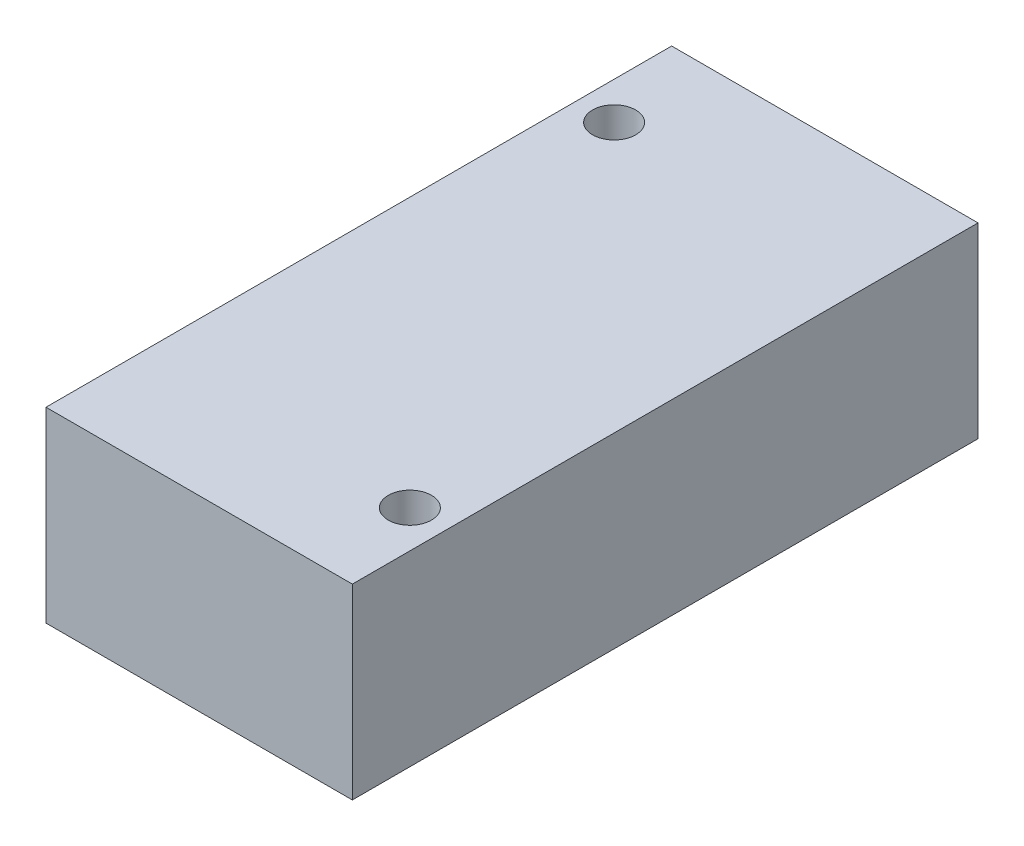
ISO-10303-21;
HEADER;
FILE_DESCRIPTION(('STEP AP214'),'2;1');
FILE_NAME('part.step','',(''),(''),'','','');
FILE_SCHEMA(('AUTOMOTIVE_DESIGN { 1 0 10303 214 1 1 1 1 }'));
ENDSEC;
DATA;
#1=APPLICATION_CONTEXT('core data for automotive mechanical design processes');
#2=APPLICATION_PROTOCOL_DEFINITION('international standard','automotive_design',2000,#1);
#3=PRODUCT_CONTEXT('',#1,'mechanical');
#4=PRODUCT('Part','Part','',(#3));
#5=PRODUCT_RELATED_PRODUCT_CATEGORY('part','',(#4));
#6=PRODUCT_DEFINITION_FORMATION('','',#4);
#7=PRODUCT_DEFINITION_CONTEXT('part definition',#1,'design');
#8=PRODUCT_DEFINITION('design','',#6,#7);
#9=PRODUCT_DEFINITION_SHAPE('','',#8);
#10=(LENGTH_UNIT() NAMED_UNIT(*) SI_UNIT(.MILLI.,.METRE.));
#11=(NAMED_UNIT(*) PLANE_ANGLE_UNIT() SI_UNIT($,.RADIAN.));
#12=(NAMED_UNIT(*) SI_UNIT($,.STERADIAN.) SOLID_ANGLE_UNIT());
#13=UNCERTAINTY_MEASURE_WITH_UNIT(LENGTH_MEASURE(1.E-05),#10,'distance_accuracy_value','');
#14=(GEOMETRIC_REPRESENTATION_CONTEXT(3) GLOBAL_UNCERTAINTY_ASSIGNED_CONTEXT((#13)) GLOBAL_UNIT_ASSIGNED_CONTEXT((#10,
#11,#12)) REPRESENTATION_CONTEXT('',''));
#15=CARTESIAN_POINT('',(0.,0.,0.));
#16=DIRECTION('',(0.,0.,1.));
#17=DIRECTION('',(1.,0.,0.));
#18=AXIS2_PLACEMENT_3D('',#15,#16,#17);
#19=CARTESIAN_POINT('',(0.,13.,0.));
#20=DIRECTION('',(0.,-1.,0.));
#21=DIRECTION('',(0.,0.,-1.));
#22=AXIS2_PLACEMENT_3D('',#19,#20,#21);
#23=PLANE('',#22);
#24=DIRECTION('',(0.,0.,-1.));
#25=VECTOR('',#24,1.);
#26=CARTESIAN_POINT('',(10.65,13.,21.75));
#27=LINE('',#26,#25);
#28=CARTESIAN_POINT('',(10.65,13.,21.75));
#29=VERTEX_POINT('',#28);
#30=CARTESIAN_POINT('',(10.65,13.,-21.75));
#31=VERTEX_POINT('',#30);
#32=EDGE_CURVE('E86',#29,#31,#27,.T.);
#33=ORIENTED_EDGE('',*,*,#32,.T.);
#34=DIRECTION('',(-1.,0.,0.));
#35=VECTOR('',#34,1.);
#36=CARTESIAN_POINT('',(-10.65,13.,-21.75));
#37=LINE('',#36,#35);
#38=CARTESIAN_POINT('',(-10.65,13.,-21.75));
#39=VERTEX_POINT('',#38);
#40=EDGE_CURVE('E81',#31,#39,#37,.T.);
#41=ORIENTED_EDGE('',*,*,#40,.T.);
#42=DIRECTION('',(0.,0.,1.));
#43=VECTOR('',#42,1.);
#44=CARTESIAN_POINT('',(-10.65,13.,21.75));
#45=LINE('',#44,#43);
#46=CARTESIAN_POINT('',(-10.65,13.,21.75));
#47=VERTEX_POINT('',#46);
#48=EDGE_CURVE('E84',#39,#47,#45,.T.);
#49=ORIENTED_EDGE('',*,*,#48,.T.);
#50=DIRECTION('',(1.,0.,0.));
#51=VECTOR('',#50,1.);
#52=CARTESIAN_POINT('',(-10.65,13.,21.75));
#53=LINE('',#52,#51);
#54=EDGE_CURVE('E51',#47,#29,#53,.T.);
#55=ORIENTED_EDGE('',*,*,#54,.T.);
#56=EDGE_LOOP('',(#33,#41,#49,#55));
#57=FACE_BOUND('',#56,.T.);
#58=CARTESIAN_POINT('',(-8.05,13.,-15.15));
#59=DIRECTION('',(0.,1.,0.));
#60=DIRECTION('',(0.,0.,1.));
#61=AXIS2_PLACEMENT_3D('',#58,#59,#60);
#62=CIRCLE('',#61,1.5);
#63=CARTESIAN_POINT('',(-8.05,13.,-16.65));
#64=VERTEX_POINT('',#63);
#65=EDGE_CURVE('E101',#64,#64,#62,.T.);
#66=ORIENTED_EDGE('',*,*,#65,.F.);
#67=EDGE_LOOP('',(#66));
#68=FACE_BOUND('',#67,.T.);
#69=CARTESIAN_POINT('',(8.05,13.,15.15));
#70=DIRECTION('',(0.,1.,0.));
#71=DIRECTION('',(0.,0.,1.));
#72=AXIS2_PLACEMENT_3D('',#69,#70,#71);
#73=CIRCLE('',#72,1.5);
#74=CARTESIAN_POINT('',(8.05,13.,13.65));
#75=VERTEX_POINT('',#74);
#76=EDGE_CURVE('E116',#75,#75,#73,.T.);
#77=ORIENTED_EDGE('',*,*,#76,.F.);
#78=EDGE_LOOP('',(#77));
#79=FACE_BOUND('',#78,.T.);
#80=ADVANCED_FACE('F34',(#57,#68,#79),#23,.F.);
#81=CARTESIAN_POINT('',(0.,0.,0.));
#82=DIRECTION('',(0.,-1.,0.));
#83=DIRECTION('',(0.,0.,-1.));
#84=AXIS2_PLACEMENT_3D('',#81,#82,#83);
#85=PLANE('',#84);
#86=CARTESIAN_POINT('',(-8.05,0.,-15.15));
#87=DIRECTION('',(0.,1.,0.));
#88=DIRECTION('',(0.,0.,1.));
#89=AXIS2_PLACEMENT_3D('',#86,#87,#88);
#90=CIRCLE('',#89,1.5);
#91=CARTESIAN_POINT('',(-8.05,0.,-16.65));
#92=VERTEX_POINT('',#91);
#93=EDGE_CURVE('E113',#92,#92,#90,.T.);
#94=ORIENTED_EDGE('',*,*,#93,.T.);
#95=EDGE_LOOP('',(#94));
#96=FACE_BOUND('',#95,.T.);
#97=DIRECTION('',(0.,0.,-1.));
#98=VECTOR('',#97,1.);
#99=CARTESIAN_POINT('',(10.65,0.,21.75));
#100=LINE('',#99,#98);
#101=CARTESIAN_POINT('',(10.65,0.,21.75));
#102=VERTEX_POINT('',#101);
#103=CARTESIAN_POINT('',(10.65,0.,-21.75));
#104=VERTEX_POINT('',#103);
#105=EDGE_CURVE('E98',#102,#104,#100,.T.);
#106=ORIENTED_EDGE('',*,*,#105,.F.);
#107=DIRECTION('',(1.,0.,0.));
#108=VECTOR('',#107,1.);
#109=CARTESIAN_POINT('',(-10.65,0.,21.75));
#110=LINE('',#109,#108);
#111=CARTESIAN_POINT('',(-10.65,0.,21.75));
#112=VERTEX_POINT('',#111);
#113=EDGE_CURVE('E74',#112,#102,#110,.T.);
#114=ORIENTED_EDGE('',*,*,#113,.F.);
#115=DIRECTION('',(0.,0.,1.));
#116=VECTOR('',#115,1.);
#117=CARTESIAN_POINT('',(-10.65,0.,21.75));
#118=LINE('',#117,#116);
#119=CARTESIAN_POINT('',(-10.65,0.,-21.75));
#120=VERTEX_POINT('',#119);
#121=EDGE_CURVE('E68',#120,#112,#118,.T.);
#122=ORIENTED_EDGE('',*,*,#121,.F.);
#123=DIRECTION('',(-1.,0.,0.));
#124=VECTOR('',#123,1.);
#125=CARTESIAN_POINT('',(-10.65,0.,-21.75));
#126=LINE('',#125,#124);
#127=EDGE_CURVE('E90',#104,#120,#126,.T.);
#128=ORIENTED_EDGE('',*,*,#127,.F.);
#129=EDGE_LOOP('',(#106,#114,#122,#128));
#130=FACE_BOUND('',#129,.T.);
#131=CARTESIAN_POINT('',(8.05,0.,15.15));
#132=DIRECTION('',(0.,1.,0.));
#133=DIRECTION('',(0.,0.,1.));
#134=AXIS2_PLACEMENT_3D('',#131,#132,#133);
#135=CIRCLE('',#134,1.5);
#136=CARTESIAN_POINT('',(8.05,0.,13.65));
#137=VERTEX_POINT('',#136);
#138=EDGE_CURVE('E119',#137,#137,#135,.T.);
#139=ORIENTED_EDGE('',*,*,#138,.T.);
#140=EDGE_LOOP('',(#139));
#141=FACE_BOUND('',#140,.T.);
#142=ADVANCED_FACE('F109',(#96,#130,#141),#85,.T.);
#143=CARTESIAN_POINT('',(10.65,13.,21.75));
#144=DIRECTION('',(-1.,0.,0.));
#145=DIRECTION('',(0.,0.,1.));
#146=AXIS2_PLACEMENT_3D('',#143,#144,#145);
#147=PLANE('',#146);
#148=ORIENTED_EDGE('',*,*,#105,.T.);
#149=DIRECTION('',(0.,-1.,0.));
#150=VECTOR('',#149,1.);
#151=CARTESIAN_POINT('',(10.65,13.,-21.75));
#152=LINE('',#151,#150);
#153=EDGE_CURVE('E11',#31,#104,#152,.T.);
#154=ORIENTED_EDGE('',*,*,#153,.F.);
#155=ORIENTED_EDGE('',*,*,#32,.F.);
#156=DIRECTION('',(0.,-1.,0.));
#157=VECTOR('',#156,1.);
#158=CARTESIAN_POINT('',(10.65,13.,21.75));
#159=LINE('',#158,#157);
#160=EDGE_CURVE('E94',#29,#102,#159,.T.);
#161=ORIENTED_EDGE('',*,*,#160,.T.);
#162=EDGE_LOOP('',(#148,#154,#155,#161));
#163=FACE_BOUND('',#162,.T.);
#164=ADVANCED_FACE('F36',(#163),#147,.F.);
#165=CARTESIAN_POINT('',(-10.65,13.,-21.75));
#166=DIRECTION('',(0.,0.,1.));
#167=DIRECTION('',(1.,0.,0.));
#168=AXIS2_PLACEMENT_3D('',#165,#166,#167);
#169=PLANE('',#168);
#170=ORIENTED_EDGE('',*,*,#127,.T.);
#171=DIRECTION('',(0.,-1.,0.));
#172=VECTOR('',#171,1.);
#173=CARTESIAN_POINT('',(-10.65,13.,-21.75));
#174=LINE('',#173,#172);
#175=EDGE_CURVE('E43',#39,#120,#174,.T.);
#176=ORIENTED_EDGE('',*,*,#175,.F.);
#177=ORIENTED_EDGE('',*,*,#40,.F.);
#178=ORIENTED_EDGE('',*,*,#153,.T.);
#179=EDGE_LOOP('',(#170,#176,#177,#178));
#180=FACE_BOUND('',#179,.T.);
#181=ADVANCED_FACE('F89',(#180),#169,.F.);
#182=CARTESIAN_POINT('',(-10.65,13.,21.75));
#183=DIRECTION('',(1.,0.,0.));
#184=DIRECTION('',(0.,0.,-1.));
#185=AXIS2_PLACEMENT_3D('',#182,#183,#184);
#186=PLANE('',#185);
#187=ORIENTED_EDGE('',*,*,#121,.T.);
#188=DIRECTION('',(0.,-1.,0.));
#189=VECTOR('',#188,1.);
#190=CARTESIAN_POINT('',(-10.65,13.,21.75));
#191=LINE('',#190,#189);
#192=EDGE_CURVE('E91',#47,#112,#191,.T.);
#193=ORIENTED_EDGE('',*,*,#192,.F.);
#194=ORIENTED_EDGE('',*,*,#48,.F.);
#195=ORIENTED_EDGE('',*,*,#175,.T.);
#196=EDGE_LOOP('',(#187,#193,#194,#195));
#197=FACE_BOUND('',#196,.T.);
#198=ADVANCED_FACE('F92',(#197),#186,.F.);
#199=CARTESIAN_POINT('',(-10.65,13.,21.75));
#200=DIRECTION('',(0.,0.,-1.));
#201=DIRECTION('',(-1.,0.,0.));
#202=AXIS2_PLACEMENT_3D('',#199,#200,#201);
#203=PLANE('',#202);
#204=ORIENTED_EDGE('',*,*,#113,.T.);
#205=ORIENTED_EDGE('',*,*,#160,.F.);
#206=ORIENTED_EDGE('',*,*,#54,.F.);
#207=ORIENTED_EDGE('',*,*,#192,.T.);
#208=EDGE_LOOP('',(#204,#205,#206,#207));
#209=FACE_BOUND('',#208,.T.);
#210=ADVANCED_FACE('F106',(#209),#203,.F.);
#211=CARTESIAN_POINT('',(-8.05,13.,-15.15));
#212=DIRECTION('',(0.,-1.,0.));
#213=DIRECTION('',(0.,0.,-1.));
#214=AXIS2_PLACEMENT_3D('',#211,#212,#213);
#215=CYLINDRICAL_SURFACE('',#214,1.5);
#216=CARTESIAN_POINT('',(-8.05,13.,-16.65));
#217=CARTESIAN_POINT('',(-8.05,12.8645833333333,-16.65));
#218=CARTESIAN_POINT('',(-8.05,12.7291666666667,-16.65));
#219=CARTESIAN_POINT('',(-8.05,12.4583333333333,-16.65));
#220=CARTESIAN_POINT('',(-8.05,12.3229166666667,-16.65));
#221=CARTESIAN_POINT('',(-8.05,12.0520833333333,-16.65));
#222=CARTESIAN_POINT('',(-8.05,11.9166666666667,-16.65));
#223=CARTESIAN_POINT('',(-8.05,11.6458333333333,-16.65));
#224=CARTESIAN_POINT('',(-8.05,11.5104166666667,-16.65));
#225=CARTESIAN_POINT('',(-8.05,11.2395833333333,-16.65));
#226=CARTESIAN_POINT('',(-8.05,11.1041666666667,-16.65));
#227=CARTESIAN_POINT('',(-8.05,10.8333333333333,-16.65));
#228=CARTESIAN_POINT('',(-8.05,10.6979166666667,-16.65));
#229=CARTESIAN_POINT('',(-8.05,10.4270833333333,-16.65));
#230=CARTESIAN_POINT('',(-8.05,10.2916666666667,-16.65));
#231=CARTESIAN_POINT('',(-8.05,10.0208333333333,-16.65));
#232=CARTESIAN_POINT('',(-8.05,9.88541666666667,-16.65));
#233=CARTESIAN_POINT('',(-8.05,9.61458333333333,-16.65));
#234=CARTESIAN_POINT('',(-8.05,9.47916666666667,-16.65));
#235=CARTESIAN_POINT('',(-8.05,9.20833333333333,-16.65));
#236=CARTESIAN_POINT('',(-8.05,9.07291666666666,-16.65));
#237=CARTESIAN_POINT('',(-8.05,8.80208333333333,-16.65));
#238=CARTESIAN_POINT('',(-8.05,8.66666666666667,-16.65));
#239=CARTESIAN_POINT('',(-8.05,8.39583333333333,-16.65));
#240=CARTESIAN_POINT('',(-8.05,8.26041666666667,-16.65));
#241=CARTESIAN_POINT('',(-8.05,7.98958333333333,-16.65));
#242=CARTESIAN_POINT('',(-8.05,7.85416666666667,-16.65));
#243=CARTESIAN_POINT('',(-8.05,7.58333333333333,-16.65));
#244=CARTESIAN_POINT('',(-8.05,7.44791666666667,-16.65));
#245=CARTESIAN_POINT('',(-8.05,7.17708333333333,-16.65));
#246=CARTESIAN_POINT('',(-8.05,7.04166666666667,-16.65));
#247=CARTESIAN_POINT('',(-8.05,6.77083333333333,-16.65));
#248=CARTESIAN_POINT('',(-8.05,6.63541666666667,-16.65));
#249=CARTESIAN_POINT('',(-8.05,6.36458333333333,-16.65));
#250=CARTESIAN_POINT('',(-8.05,6.22916666666667,-16.65));
#251=CARTESIAN_POINT('',(-8.05,5.95833333333333,-16.65));
#252=CARTESIAN_POINT('',(-8.05,5.82291666666667,-16.65));
#253=CARTESIAN_POINT('',(-8.05,5.55208333333333,-16.65));
#254=CARTESIAN_POINT('',(-8.05,5.41666666666667,-16.65));
#255=CARTESIAN_POINT('',(-8.05,5.14583333333333,-16.65));
#256=CARTESIAN_POINT('',(-8.05,5.01041666666667,-16.65));
#257=CARTESIAN_POINT('',(-8.05,4.73958333333333,-16.65));
#258=CARTESIAN_POINT('',(-8.05,4.60416666666667,-16.65));
#259=CARTESIAN_POINT('',(-8.05,4.33333333333333,-16.65));
#260=CARTESIAN_POINT('',(-8.05,4.19791666666667,-16.65));
#261=CARTESIAN_POINT('',(-8.05,3.92708333333333,-16.65));
#262=CARTESIAN_POINT('',(-8.05,3.79166666666667,-16.65));
#263=CARTESIAN_POINT('',(-8.05,3.52083333333333,-16.65));
#264=CARTESIAN_POINT('',(-8.05,3.38541666666667,-16.65));
#265=CARTESIAN_POINT('',(-8.05,3.11458333333333,-16.65));
#266=CARTESIAN_POINT('',(-8.05,2.97916666666667,-16.65));
#267=CARTESIAN_POINT('',(-8.05,2.70833333333333,-16.65));
#268=CARTESIAN_POINT('',(-8.05,2.57291666666667,-16.65));
#269=CARTESIAN_POINT('',(-8.05,2.30208333333333,-16.65));
#270=CARTESIAN_POINT('',(-8.05,2.16666666666667,-16.65));
#271=CARTESIAN_POINT('',(-8.05,1.89583333333333,-16.65));
#272=CARTESIAN_POINT('',(-8.05,1.76041666666667,-16.65));
#273=CARTESIAN_POINT('',(-8.05,1.48958333333333,-16.65));
#274=CARTESIAN_POINT('',(-8.05,1.35416666666667,-16.65));
#275=CARTESIAN_POINT('',(-8.05,1.08333333333333,-16.65));
#276=CARTESIAN_POINT('',(-8.05,0.947916666666667,-16.65));
#277=CARTESIAN_POINT('',(-8.05,0.677083333333334,-16.65));
#278=CARTESIAN_POINT('',(-8.05,0.541666666666667,-16.65));
#279=CARTESIAN_POINT('',(-8.05,0.270833333333334,-16.65));
#280=CARTESIAN_POINT('',(-8.05,0.135416666666667,-16.65));
#281=CARTESIAN_POINT('',(-8.05,0.,-16.65));
#282=B_SPLINE_CURVE_WITH_KNOTS('',3,(#216,#217,#218,#219,#220,#221,#222,#223,#224,#225,#226,
#227,#228,#229,#230,#231,#232,#233,#234,#235,#236,#237,#238,#239,#240,#241,#242,#243,#244,#245,
#246,#247,#248,#249,#250,#251,#252,#253,#254,#255,#256,#257,#258,#259,#260,#261,#262,#263,#264,
#265,#266,#267,#268,#269,#270,#271,#272,#273,#274,#275,#276,#277,#278,#279,#280,#281),
.UNSPECIFIED.,.F.,.F.,(4,2,2,2,2,2,2,2,2,2,2,2,2,2,2,2,2,2,2,2,2,2,2,2,2,2,2,2,2,2,2,2,4),(0.,
0.40625,0.812500000000001,1.21875,1.625,2.03125,2.4375,2.84375,3.25,3.65625,4.0625,4.46875,
4.875,5.28125,5.6875,6.09375,6.5,6.90625,7.3125,7.71875,8.125,8.53125,8.9375,9.34375,9.75,
10.15625,10.5625,10.96875,11.375,11.78125,12.1875,12.59375,13.),.UNSPECIFIED.);
#283=EDGE_CURVE('BSEAM136',#64,#92,#282,.T.);
#284=ORIENTED_EDGE('',*,*,#65,.T.);
#285=ORIENTED_EDGE('',*,*,#93,.F.);
#286=ORIENTED_EDGE('',*,*,#283,.T.);
#287=ORIENTED_EDGE('',*,*,#283,.F.);
#288=EDGE_LOOP('',(#284,#286,#285,#287));
#289=FACE_BOUND('',#288,.T.);
#290=ADVANCED_FACE('F136',(#289),#215,.F.);
#291=CARTESIAN_POINT('',(8.05,13.,15.15));
#292=DIRECTION('',(0.,-1.,0.));
#293=DIRECTION('',(0.,0.,-1.));
#294=AXIS2_PLACEMENT_3D('',#291,#292,#293);
#295=CYLINDRICAL_SURFACE('',#294,1.5);
#296=CARTESIAN_POINT('',(8.05,13.,13.65));
#297=CARTESIAN_POINT('',(8.05,12.8645833333333,13.65));
#298=CARTESIAN_POINT('',(8.05,12.7291666666667,13.65));
#299=CARTESIAN_POINT('',(8.05,12.4583333333333,13.65));
#300=CARTESIAN_POINT('',(8.05,12.3229166666667,13.65));
#301=CARTESIAN_POINT('',(8.05,12.0520833333333,13.65));
#302=CARTESIAN_POINT('',(8.05,11.9166666666667,13.65));
#303=CARTESIAN_POINT('',(8.05,11.6458333333333,13.65));
#304=CARTESIAN_POINT('',(8.05,11.5104166666667,13.65));
#305=CARTESIAN_POINT('',(8.05,11.2395833333333,13.65));
#306=CARTESIAN_POINT('',(8.05,11.1041666666667,13.65));
#307=CARTESIAN_POINT('',(8.05,10.8333333333333,13.65));
#308=CARTESIAN_POINT('',(8.05,10.6979166666667,13.65));
#309=CARTESIAN_POINT('',(8.05,10.4270833333333,13.65));
#310=CARTESIAN_POINT('',(8.05,10.2916666666667,13.65));
#311=CARTESIAN_POINT('',(8.05,10.0208333333333,13.65));
#312=CARTESIAN_POINT('',(8.05,9.88541666666667,13.65));
#313=CARTESIAN_POINT('',(8.05,9.61458333333333,13.65));
#314=CARTESIAN_POINT('',(8.05,9.47916666666667,13.65));
#315=CARTESIAN_POINT('',(8.05,9.20833333333333,13.65));
#316=CARTESIAN_POINT('',(8.05,9.07291666666666,13.65));
#317=CARTESIAN_POINT('',(8.05,8.80208333333333,13.65));
#318=CARTESIAN_POINT('',(8.05,8.66666666666667,13.65));
#319=CARTESIAN_POINT('',(8.05,8.39583333333333,13.65));
#320=CARTESIAN_POINT('',(8.05,8.26041666666667,13.65));
#321=CARTESIAN_POINT('',(8.05,7.98958333333333,13.65));
#322=CARTESIAN_POINT('',(8.05,7.85416666666667,13.65));
#323=CARTESIAN_POINT('',(8.05,7.58333333333333,13.65));
#324=CARTESIAN_POINT('',(8.05,7.44791666666667,13.65));
#325=CARTESIAN_POINT('',(8.05,7.17708333333333,13.65));
#326=CARTESIAN_POINT('',(8.05,7.04166666666667,13.65));
#327=CARTESIAN_POINT('',(8.05,6.77083333333333,13.65));
#328=CARTESIAN_POINT('',(8.05,6.63541666666667,13.65));
#329=CARTESIAN_POINT('',(8.05,6.36458333333333,13.65));
#330=CARTESIAN_POINT('',(8.05,6.22916666666667,13.65));
#331=CARTESIAN_POINT('',(8.05,5.95833333333333,13.65));
#332=CARTESIAN_POINT('',(8.05,5.82291666666667,13.65));
#333=CARTESIAN_POINT('',(8.05,5.55208333333333,13.65));
#334=CARTESIAN_POINT('',(8.05,5.41666666666667,13.65));
#335=CARTESIAN_POINT('',(8.05,5.14583333333333,13.65));
#336=CARTESIAN_POINT('',(8.05,5.01041666666667,13.65));
#337=CARTESIAN_POINT('',(8.05,4.73958333333333,13.65));
#338=CARTESIAN_POINT('',(8.05,4.60416666666667,13.65));
#339=CARTESIAN_POINT('',(8.05,4.33333333333333,13.65));
#340=CARTESIAN_POINT('',(8.05,4.19791666666667,13.65));
#341=CARTESIAN_POINT('',(8.05,3.92708333333333,13.65));
#342=CARTESIAN_POINT('',(8.05,3.79166666666667,13.65));
#343=CARTESIAN_POINT('',(8.05,3.52083333333333,13.65));
#344=CARTESIAN_POINT('',(8.05,3.38541666666667,13.65));
#345=CARTESIAN_POINT('',(8.05,3.11458333333333,13.65));
#346=CARTESIAN_POINT('',(8.05,2.97916666666667,13.65));
#347=CARTESIAN_POINT('',(8.05,2.70833333333333,13.65));
#348=CARTESIAN_POINT('',(8.05,2.57291666666667,13.65));
#349=CARTESIAN_POINT('',(8.05,2.30208333333333,13.65));
#350=CARTESIAN_POINT('',(8.05,2.16666666666667,13.65));
#351=CARTESIAN_POINT('',(8.05,1.89583333333333,13.65));
#352=CARTESIAN_POINT('',(8.05,1.76041666666667,13.65));
#353=CARTESIAN_POINT('',(8.05,1.48958333333333,13.65));
#354=CARTESIAN_POINT('',(8.05,1.35416666666667,13.65));
#355=CARTESIAN_POINT('',(8.05,1.08333333333333,13.65));
#356=CARTESIAN_POINT('',(8.05,0.947916666666667,13.65));
#357=CARTESIAN_POINT('',(8.05,0.677083333333334,13.65));
#358=CARTESIAN_POINT('',(8.05,0.541666666666667,13.65));
#359=CARTESIAN_POINT('',(8.05,0.270833333333334,13.65));
#360=CARTESIAN_POINT('',(8.05,0.135416666666667,13.65));
#361=CARTESIAN_POINT('',(8.05,0.,13.65));
#362=B_SPLINE_CURVE_WITH_KNOTS('',3,(#296,#297,#298,#299,#300,#301,#302,#303,#304,#305,#306,
#307,#308,#309,#310,#311,#312,#313,#314,#315,#316,#317,#318,#319,#320,#321,#322,#323,#324,#325,
#326,#327,#328,#329,#330,#331,#332,#333,#334,#335,#336,#337,#338,#339,#340,#341,#342,#343,#344,
#345,#346,#347,#348,#349,#350,#351,#352,#353,#354,#355,#356,#357,#358,#359,#360,#361),
.UNSPECIFIED.,.F.,.F.,(4,2,2,2,2,2,2,2,2,2,2,2,2,2,2,2,2,2,2,2,2,2,2,2,2,2,2,2,2,2,2,2,4),(0.,
0.40625,0.812500000000001,1.21875,1.625,2.03125,2.4375,2.84375,3.25,3.65625,4.0625,4.46875,
4.875,5.28125,5.6875,6.09375,6.5,6.90625,7.3125,7.71875,8.125,8.53125,8.9375,9.34375,9.75,
10.15625,10.5625,10.96875,11.375,11.78125,12.1875,12.59375,13.),.UNSPECIFIED.);
#363=EDGE_CURVE('BSEAM125',#75,#137,#362,.T.);
#364=ORIENTED_EDGE('',*,*,#76,.T.);
#365=ORIENTED_EDGE('',*,*,#138,.F.);
#366=ORIENTED_EDGE('',*,*,#363,.T.);
#367=ORIENTED_EDGE('',*,*,#363,.F.);
#368=EDGE_LOOP('',(#364,#366,#365,#367));
#369=FACE_BOUND('',#368,.T.);
#370=ADVANCED_FACE('F125',(#369),#295,.F.);
#371=CLOSED_SHELL('',(#80,#142,#164,#181,#198,#210,#290,#370));
#372=MANIFOLD_SOLID_BREP('B2',#371);
#373=ADVANCED_BREP_SHAPE_REPRESENTATION('',(#18,#372),#14);
#374=SHAPE_DEFINITION_REPRESENTATION(#9,#373);
ENDSEC;
END-ISO-10303-21;
